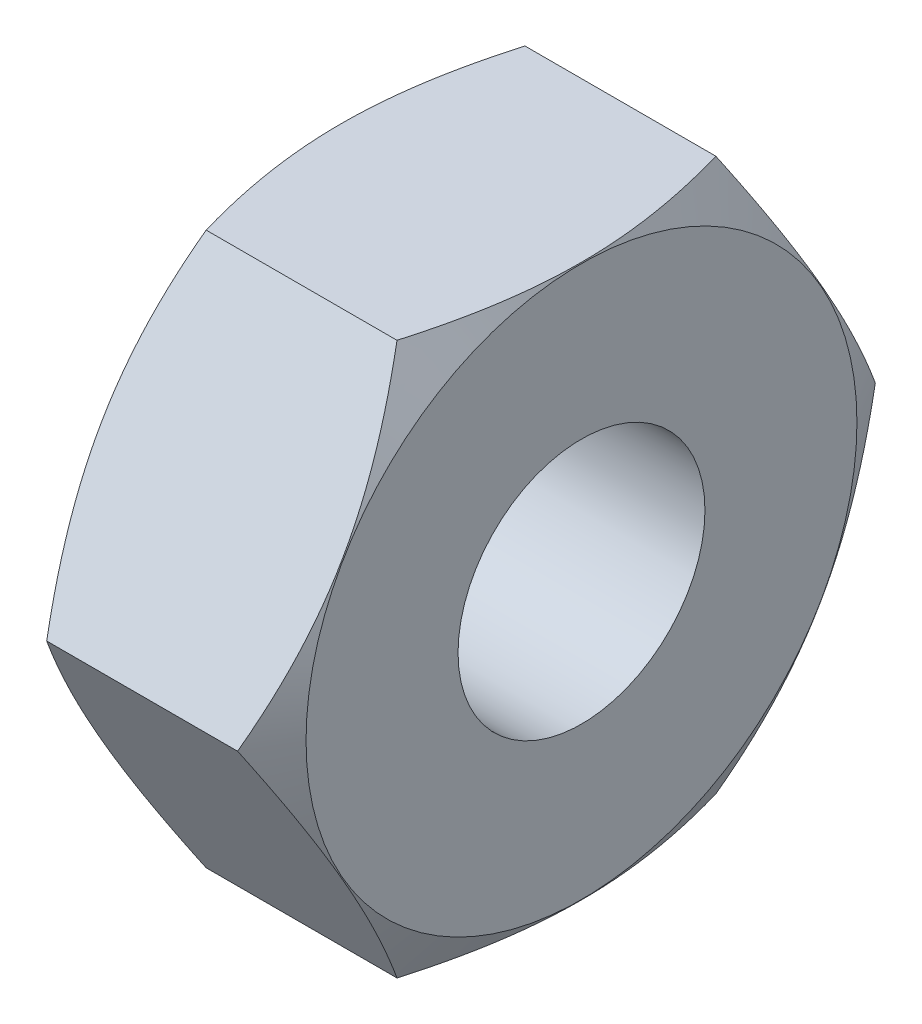
ISO-10303-21;
HEADER;
FILE_DESCRIPTION(('STEP AP214'),'2;1');
FILE_NAME('part.step','',(''),(''),'','','');
FILE_SCHEMA(('AUTOMOTIVE_DESIGN { 1 0 10303 214 1 1 1 1 }'));
ENDSEC;
DATA;
#1=APPLICATION_CONTEXT('core data for automotive mechanical design processes');
#2=APPLICATION_PROTOCOL_DEFINITION('international standard','automotive_design',2000,#1);
#3=PRODUCT_CONTEXT('',#1,'mechanical');
#4=PRODUCT('Part','Part','',(#3));
#5=PRODUCT_RELATED_PRODUCT_CATEGORY('part','',(#4));
#6=PRODUCT_DEFINITION_FORMATION('','',#4);
#7=PRODUCT_DEFINITION_CONTEXT('part definition',#1,'design');
#8=PRODUCT_DEFINITION('design','',#6,#7);
#9=PRODUCT_DEFINITION_SHAPE('','',#8);
#10=(LENGTH_UNIT() NAMED_UNIT(*) SI_UNIT(.MILLI.,.METRE.));
#11=(NAMED_UNIT(*) PLANE_ANGLE_UNIT() SI_UNIT($,.RADIAN.));
#12=(NAMED_UNIT(*) SI_UNIT($,.STERADIAN.) SOLID_ANGLE_UNIT());
#13=UNCERTAINTY_MEASURE_WITH_UNIT(LENGTH_MEASURE(1.E-05),#10,'distance_accuracy_value','');
#14=(GEOMETRIC_REPRESENTATION_CONTEXT(3) GLOBAL_UNCERTAINTY_ASSIGNED_CONTEXT((#13)) GLOBAL_UNIT_ASSIGNED_CONTEXT((#10,
#11,#12)) REPRESENTATION_CONTEXT('',''));
#15=CARTESIAN_POINT('',(0.,0.,0.));
#16=DIRECTION('',(0.,0.,1.));
#17=DIRECTION('',(1.,0.,0.));
#18=AXIS2_PLACEMENT_3D('',#15,#16,#17);
#19=CARTESIAN_POINT('',(2.14892304541081,0.,0.));
#20=DIRECTION('',(-1.,0.,0.));
#21=DIRECTION('',(0.,0.,1.));
#22=AXIS2_PLACEMENT_3D('',#19,#20,#21);
#23=CONICAL_SURFACE('',#22,3.17802018664956,1.04719755114892);
#24=CARTESIAN_POINT('',(2.40000000003932,0.,0.));
#25=DIRECTION('',(-1.,0.,0.));
#26=DIRECTION('',(0.,0.,1.));
#27=AXIS2_PLACEMENT_3D('',#24,#25,#26);
#28=CIRCLE('',#27,2.7431421446712);
#29=CARTESIAN_POINT('',(2.40000000003932,0.,2.7431421446712));
#30=VERTEX_POINT('',#29);
#31=EDGE_CURVE('E142',#30,#30,#28,.F.);
#32=ORIENTED_EDGE('',*,*,#31,.F.);
#33=EDGE_LOOP('',(#32));
#34=FACE_BOUND('',#33,.T.);
#35=CARTESIAN_POINT('',(2.15042052232973,1.45278138934542E-12,-3.17542648054311));
#36=CARTESIAN_POINT('',(2.18652020945351,-0.108296218026511,-3.11290162991242));
#37=CARTESIAN_POINT('',(2.21969549696416,-0.217406043580234,-3.04990704275771));
#38=CARTESIAN_POINT('',(2.27873318069712,-0.437326420572169,-2.92293595390107));
#39=CARTESIAN_POINT('',(2.30458022890113,-0.548140036408943,-2.8589576829678));
#40=CARTESIAN_POINT('',(2.34685631415812,-0.768596354324481,-2.73167716847465));
#41=CARTESIAN_POINT('',(2.36348308627782,-0.878209802028639,-2.66839181493582));
#42=CARTESIAN_POINT('',(2.38698245443939,-1.09812310584404,-2.54142480977955));
#43=CARTESIAN_POINT('',(2.39386475225382,-1.20842216926501,-2.47774361582205));
#44=CARTESIAN_POINT('',(2.39747563485164,-1.4382919216215,-2.34502825242042));
#45=CARTESIAN_POINT('',(2.39331620815094,-1.55787402868246,-2.27598749071847));
#46=CARTESIAN_POINT('',(2.37331145510009,-1.79642268032539,-2.13826136247754));
#47=CARTESIAN_POINT('',(2.35745243373575,-1.91538833883968,-2.06957650750996));
#48=CARTESIAN_POINT('',(2.31491085159293,-2.15482257621697,-1.93133908610689));
#49=CARTESIAN_POINT('',(2.2879704169041,-2.27525560682063,-1.86180704346852));
#50=CARTESIAN_POINT('',(2.22529451656749,-2.51411551057203,-1.72390121373896));
#51=CARTESIAN_POINT('',(2.18957966458872,-2.6325464001957,-1.65552510773434));
#52=CARTESIAN_POINT('',(2.15042052232947,-2.75000000000237,-1.58771324026863));
#53=B_SPLINE_CURVE_WITH_KNOTS('',3,(#35,#36,#37,#38,#39,#40,#41,#42,#43,#44,#45,#46,#47,#48,#49,
#50,#51,#52),.UNSPECIFIED.,.F.,.F.,(4,2,2,2,2,2,2,2,4),(0.,0.390571407838746,0.781954872644651,
1.16458363617538,1.54683117915525,1.96073220717392,2.37511849923312,2.79974871437564,
3.22339073163661),.UNSPECIFIED.);
#54=CARTESIAN_POINT('',(2.1504205223301,-8.74322087722001E-13,-3.17542648054248));
#55=VERTEX_POINT('',#54);
#56=CARTESIAN_POINT('',(2.15042052232986,-2.75000000000118,-1.58771324026932));
#57=VERTEX_POINT('',#56);
#58=EDGE_CURVE('E89',#55,#57,#53,.T.);
#59=ORIENTED_EDGE('',*,*,#58,.F.);
#60=CARTESIAN_POINT('',(2.15042052233038,2.75000000000161,-1.5877132402668));
#61=CARTESIAN_POINT('',(2.19071414778613,2.62915415460132,-1.65748362163914));
#62=CARTESIAN_POINT('',(2.22735909132699,2.5072651695825,-1.72785625995104));
#63=CARTESIAN_POINT('',(2.2913217396723,2.26137677330259,-1.86981999173392));
#64=CARTESIAN_POINT('',(2.31861681938613,2.13737299450275,-1.94141360680458));
#65=CARTESIAN_POINT('',(2.36110357880501,1.89090215357231,-2.08371361316323));
#66=CARTESIAN_POINT('',(2.37657806441176,1.76847300351671,-2.15439811590452));
#67=CARTESIAN_POINT('',(2.39504791617967,1.52303893435101,-2.29609954180572));
#68=CARTESIAN_POINT('',(2.39805858064441,1.40003490671491,-2.36711595027286));
#69=CARTESIAN_POINT('',(2.39177937339437,1.17021507663329,-2.49980249103567));
#70=CARTESIAN_POINT('',(2.38403125518364,1.06336478784995,-2.56149253402775));
#71=CARTESIAN_POINT('',(2.35947923386532,0.850360305060963,-2.68447072950463));
#72=CARTESIAN_POINT('',(2.34266695204388,0.744206847231058,-2.74575845695817));
#73=CARTESIAN_POINT('',(2.30063950150585,0.530763555119573,-2.86898999911552));
#74=CARTESIAN_POINT('',(2.2752462642931,0.423500721339415,-2.93091822507257));
#75=CARTESIAN_POINT('',(2.21761435118308,0.210574416237345,-3.05385128464086));
#76=CARTESIAN_POINT('',(2.18538920779962,0.104908219187618,-3.11485769195179));
#77=CARTESIAN_POINT('',(2.15042052233046,-3.20162906590528E-12,-3.17542648054185));
#78=B_SPLINE_CURVE_WITH_KNOTS('',3,(#60,#61,#62,#63,#64,#65,#66,#67,#68,#69,#70,#71,#72,#73,#74,
#75,#76,#77),.UNSPECIFIED.,.F.,.F.,(4,2,2,2,2,2,2,2,4),(0.,0.435897015898525,0.872841498428282,
1.29897295848179,1.72458122226139,2.09509820114235,2.4659582664875,2.84504223094046,
3.22338221359978),.UNSPECIFIED.);
#79=CARTESIAN_POINT('',(2.15042052233001,2.7500000000008,-1.58771324026945));
#80=VERTEX_POINT('',#79);
#81=EDGE_CURVE('E93',#80,#55,#78,.T.);
#82=ORIENTED_EDGE('',*,*,#81,.F.);
#83=CARTESIAN_POINT('',(2.15042052232947,2.75,1.58771324027273));
#84=CARTESIAN_POINT('',(2.19071414778518,2.75,1.44817247752802));
#85=CARTESIAN_POINT('',(2.22735909132599,2.75,1.30742720090418));
#86=CARTESIAN_POINT('',(2.29132173967118,2.75,1.02349973733834));
#87=CARTESIAN_POINT('',(2.31861681938494,2.75,0.880312507197005));
#88=CARTESIAN_POINT('',(2.36110357880368,2.75,0.595712494479638));
#89=CARTESIAN_POINT('',(2.37657806441035,2.75,0.454343488997021));
#90=CARTESIAN_POINT('',(2.3950479161781,2.75,0.170940637194578));
#91=CARTESIAN_POINT('',(2.39805858064276,2.75,0.0289078202602574));
#92=CARTESIAN_POINT('',(2.39177937339257,2.75,-0.23646526126491));
#93=CARTESIAN_POINT('',(2.38403125518182,2.75,-0.3598453472486));
#94=CARTESIAN_POINT('',(2.35947923386353,2.75,-0.605801738201424));
#95=CARTESIAN_POINT('',(2.34266695204214,2.75,-0.72837719310803));
#96=CARTESIAN_POINT('',(2.30063950150428,2.75,-0.974840277421779));
#97=CARTESIAN_POINT('',(2.27524626429165,2.75,-1.09869672933539));
#98=CARTESIAN_POINT('',(2.21761435118192,2.75,-1.34456284847104));
#99=CARTESIAN_POINT('',(2.18538920779863,2.75,-1.46657566309245));
#100=CARTESIAN_POINT('',(2.15042052232965,2.75,-1.5877132402721));
#101=B_SPLINE_CURVE_WITH_KNOTS('',3,(#83,#84,#85,#86,#87,#88,#89,#90,#91,#92,#93,#94,#95,#96,
#97,#98,#99,#100),.UNSPECIFIED.,.F.,.F.,(4,2,2,2,2,2,2,2,4),(0.,0.435897015898741,
0.872841498428709,1.29897295848245,1.72458122226228,2.09509820114198,2.46595826648586,
2.84504223093748,3.22338221359546),.UNSPECIFIED.);
#102=CARTESIAN_POINT('',(2.15042052232986,2.75000000000118,1.58771324026932));
#103=VERTEX_POINT('',#102);
#104=EDGE_CURVE('E134',#103,#80,#101,.T.);
#105=ORIENTED_EDGE('',*,*,#104,.F.);
#106=CARTESIAN_POINT('',(2.15042052232969,-1.58809752952619E-12,3.17542648054319));
#107=CARTESIAN_POINT('',(2.1865202093893,0.108296217834174,3.11290163002349));
#108=CARTESIAN_POINT('',(2.21969549684621,0.217406043192452,3.04990704298161));
#109=CARTESIAN_POINT('',(2.27873318050031,0.437326419787372,2.92293595435416));
#110=CARTESIAN_POINT('',(2.30458022867931,0.548140035422557,2.85895768353727));
#111=CARTESIAN_POINT('',(2.34685631392451,0.768596352940095,2.73167716927395));
#112=CARTESIAN_POINT('',(2.36348308605626,0.87820980044797,2.6683918158485));
#113=CARTESIAN_POINT('',(2.38698245428116,1.09812310387153,2.54142481091829));
#114=CARTESIAN_POINT('',(2.39386475214679,1.20842216709696,2.47774361707348));
#115=CARTESIAN_POINT('',(2.39747563489613,1.43829191945138,2.34502825367301));
#116=CARTESIAN_POINT('',(2.39331620825858,1.55787402670682,2.27598749185903));
#117=CARTESIAN_POINT('',(2.3733114552912,1.79642267874065,2.13826136339257));
#118=CARTESIAN_POINT('',(2.35745243394708,1.91538833745138,2.06957650831152));
#119=CARTESIAN_POINT('',(2.31491085180498,2.15482257522765,1.93133908667805));
#120=CARTESIAN_POINT('',(2.28797041709526,2.27525560603373,1.86180704392282));
#121=CARTESIAN_POINT('',(2.22529451668474,2.51411551018358,1.72390121396325));
#122=CARTESIAN_POINT('',(2.18957966465306,2.63254640000331,1.65552510784544));
#123=CARTESIAN_POINT('',(2.15042052232947,2.75000000000237,1.58771324026863));
#124=B_SPLINE_CURVE_WITH_KNOTS('',3,(#106,#107,#108,#109,#110,#111,#112,#113,#114,#115,#116,
#117,#118,#119,#120,#121,#122,#123),.UNSPECIFIED.,.F.,.F.,(4,2,2,2,2,2,2,2,4),(0.,
0.390571407144769,0.78195487125283,1.16458363411619,1.54683117643086,1.96073220511382,
2.37511849783946,2.79974871368044,3.22339073163641),.UNSPECIFIED.);
#125=CARTESIAN_POINT('',(2.15042052233048,2.15867719083677E-12,3.17542648054182));
#126=VERTEX_POINT('',#125);
#127=EDGE_CURVE('E85',#126,#103,#124,.T.);
#128=ORIENTED_EDGE('',*,*,#127,.F.);
#129=CARTESIAN_POINT('',(2.15042052233038,-2.75000000000161,1.5877132402668));
#130=CARTESIAN_POINT('',(2.19071414778613,-2.62915415460132,1.65748362163914));
#131=CARTESIAN_POINT('',(2.22735909132699,-2.5072651695825,1.72785625995104));
#132=CARTESIAN_POINT('',(2.2913217396723,-2.26137677330259,1.86981999173393));
#133=CARTESIAN_POINT('',(2.31861681938613,-2.13737299450275,1.94141360680458));
#134=CARTESIAN_POINT('',(2.36110357880501,-1.89090215357231,2.08371361316323));
#135=CARTESIAN_POINT('',(2.37657806441176,-1.76847300351671,2.15439811590453));
#136=CARTESIAN_POINT('',(2.39504791617967,-1.52303893435101,2.29609954180572));
#137=CARTESIAN_POINT('',(2.39805858064441,-1.40003490671491,2.36711595027287));
#138=CARTESIAN_POINT('',(2.39177937339437,-1.17021507663328,2.49980249103568));
#139=CARTESIAN_POINT('',(2.38403125518364,-1.06336478784993,2.56149253402777));
#140=CARTESIAN_POINT('',(2.35947923386531,-0.850360305060917,2.68447072950466));
#141=CARTESIAN_POINT('',(2.34266695204387,-0.744206847231001,2.7457584569582));
#142=CARTESIAN_POINT('',(2.30063950150583,-0.530763555119493,2.86898999911556));
#143=CARTESIAN_POINT('',(2.27524626429307,-0.423500721339323,2.93091822507262));
#144=CARTESIAN_POINT('',(2.21761435118305,-0.21057441623723,3.05385128464093));
#145=CARTESIAN_POINT('',(2.18538920779958,-0.104908219187491,3.11485769195187));
#146=CARTESIAN_POINT('',(2.15042052233041,3.33919464111223E-12,3.17542648054193));
#147=B_SPLINE_CURVE_WITH_KNOTS('',3,(#129,#130,#131,#132,#133,#134,#135,#136,#137,#138,#139,
#140,#141,#142,#143,#144,#145,#146),.UNSPECIFIED.,.F.,.F.,(4,2,2,2,2,2,2,2,4),(0.,
0.435897015898525,0.872841498428282,1.29897295848179,1.72458122226139,2.09509820114239,
2.46595826648758,2.84504223094058,3.22338221359994),.UNSPECIFIED.);
#148=CARTESIAN_POINT('',(2.15042052233001,-2.7500000000008,1.58771324026945));
#149=VERTEX_POINT('',#148);
#150=EDGE_CURVE('E21',#149,#126,#147,.T.);
#151=ORIENTED_EDGE('',*,*,#150,.F.);
#152=CARTESIAN_POINT('',(2.15042052232947,-2.75,-1.58771324027273));
#153=CARTESIAN_POINT('',(2.19071414778518,-2.75,-1.44817247752802));
#154=CARTESIAN_POINT('',(2.22735909132599,-2.75,-1.30742720090418));
#155=CARTESIAN_POINT('',(2.29132173967118,-2.75,-1.02349973733834));
#156=CARTESIAN_POINT('',(2.31861681938494,-2.75,-0.880312507197005));
#157=CARTESIAN_POINT('',(2.36110357880368,-2.75,-0.595712494479638));
#158=CARTESIAN_POINT('',(2.37657806441035,-2.75,-0.454343488997021));
#159=CARTESIAN_POINT('',(2.3950479161781,-2.75,-0.170940637194578));
#160=CARTESIAN_POINT('',(2.39805858064276,-2.75,-0.0289078202602574));
#161=CARTESIAN_POINT('',(2.39177937339257,-2.75,0.23646526126491));
#162=CARTESIAN_POINT('',(2.38403125518182,-2.75,0.3598453472486));
#163=CARTESIAN_POINT('',(2.35947923386353,-2.75,0.605801738201424));
#164=CARTESIAN_POINT('',(2.34266695204214,-2.75,0.72837719310803));
#165=CARTESIAN_POINT('',(2.30063950150428,-2.75,0.974840277421779));
#166=CARTESIAN_POINT('',(2.27524626429165,-2.75,1.09869672933539));
#167=CARTESIAN_POINT('',(2.21761435118192,-2.75,1.34456284847104));
#168=CARTESIAN_POINT('',(2.18538920779863,-2.75,1.46657566309245));
#169=CARTESIAN_POINT('',(2.15042052232965,-2.75,1.5877132402721));
#170=B_SPLINE_CURVE_WITH_KNOTS('',3,(#152,#153,#154,#155,#156,#157,#158,#159,#160,#161,#162,
#163,#164,#165,#166,#167,#168,#169),.UNSPECIFIED.,.F.,.F.,(4,2,2,2,2,2,2,2,4),(0.,
0.435897015898741,0.872841498428709,1.29897295848245,1.72458122226228,2.09509820114198,
2.46595826648586,2.84504223093748,3.22338221359546),.UNSPECIFIED.);
#171=EDGE_CURVE('E71',#57,#149,#170,.T.);
#172=ORIENTED_EDGE('',*,*,#171,.F.);
#173=EDGE_LOOP('',(#59,#82,#105,#128,#151,#172));
#174=FACE_BOUND('',#173,.T.);
#175=ADVANCED_FACE('F17',(#34,#174),#23,.T.);
#176=CARTESIAN_POINT('',(0.,0.,3.17542648054));
#177=DIRECTION('',(0.,-0.50000000000019,0.866025403784329));
#178=DIRECTION('',(0.,-0.866025403784329,-0.50000000000019));
#179=AXIS2_PLACEMENT_3D('',#176,#177,#178);
#180=PLANE('',#179);
#181=ORIENTED_EDGE('',*,*,#150,.T.);
#182=DIRECTION('',(1.,0.,0.));
#183=VECTOR('',#182,1.);
#184=CARTESIAN_POINT('',(0.,9.78384040450919E-13,3.17542648054171));
#185=LINE('',#184,#183);
#186=CARTESIAN_POINT('',(0.249579465219581,-3.75031432139668E-08,3.17542645888812));
#187=VERTEX_POINT('',#186);
#188=EDGE_CURVE('E147',#187,#126,#185,.T.);
#189=ORIENTED_EDGE('',*,*,#188,.F.);
#190=CARTESIAN_POINT('',(0.249579452715485,-2.74999992498764,1.58771328357798));
#191=CARTESIAN_POINT('',(0.209285829319943,-2.62915408085408,1.65748366421779));
#192=CARTESIAN_POINT('',(0.172640887966145,-2.50726509711079,1.72785630179278));
#193=CARTESIAN_POINT('',(0.10867824415789,-2.26137670350815,1.86982003202958));
#194=CARTESIAN_POINT('',(0.0813831667911862,-2.13737292611086,1.9414136462906));
#195=CARTESIAN_POINT('',(0.0388964120103443,-1.89090208792963,2.0837136510621));
#196=CARTESIAN_POINT('',(0.0234219287087635,-1.76847293921509,2.15439815302909));
#197=CARTESIAN_POINT('',(0.00495208139427285,-1.52303887288675,2.29609957729211));
#198=CARTESIAN_POINT('',(0.00194141907967536,-1.40003484674664,2.36711598489556));
#199=CARTESIAN_POINT('',(0.00822062972550785,-1.17021502934359,2.4998025183384));
#200=CARTESIAN_POINT('',(0.0159687483505298,-1.06336475170375,2.56149255489678));
#201=CARTESIAN_POINT('',(0.040520768537515,-0.850360291112134,2.68447073755799));
#202=CARTESIAN_POINT('',(0.0573330488088625,-0.744206844335755,2.74575845862977));
#203=CARTESIAN_POINT('',(0.0993604945101079,-0.530763574647563,2.86898998784103));
#204=CARTESIAN_POINT('',(0.124753728373979,-0.423500752227346,2.93091820723941));
#205=CARTESIAN_POINT('',(0.182385633514425,-0.210574469459351,3.05385125391312));
#206=CARTESIAN_POINT('',(0.214610772283519,-0.104908283385116,3.11485765488735));
#207=CARTESIAN_POINT('',(0.249579452717868,-7.5007292096348E-08,3.17542643723452));
#208=B_SPLINE_CURVE_WITH_KNOTS('',3,(#190,#191,#192,#193,#194,#195,#196,#197,#198,#199,#200,
#201,#202,#203,#204,#205,#206,#207),.UNSPECIFIED.,.F.,.F.,(4,2,2,2,2,2,2,2,4),(0.,
0.435897009958034,0.872841486384562,1.29897294106713,1.72458119954067,2.09509814009642,
2.46595816697182,2.84504209091765,3.22338203335723),.UNSPECIFIED.);
#209=CARTESIAN_POINT('',(0.249579482525675,-2.75,1.58771325691191));
#210=VERTEX_POINT('',#209);
#211=EDGE_CURVE('E92',#210,#187,#208,.T.);
#212=ORIENTED_EDGE('',*,*,#211,.F.);
#213=DIRECTION('',(1.,0.,0.));
#214=VECTOR('',#213,1.);
#215=CARTESIAN_POINT('',(0.,-2.75,1.58771324027));
#216=LINE('',#215,#214);
#217=EDGE_CURVE('E76',#149,#210,#216,.F.);
#218=ORIENTED_EDGE('',*,*,#217,.F.);
#219=EDGE_LOOP('',(#181,#189,#212,#218));
#220=FACE_BOUND('',#219,.T.);
#221=ADVANCED_FACE('F91',(#220),#180,.T.);
#222=CARTESIAN_POINT('',(0.,-2.75,-1.58771324027));
#223=DIRECTION('',(0.,-0.50000000000019,-0.866025403784329));
#224=DIRECTION('',(0.,0.866025403784329,-0.50000000000019));
#225=AXIS2_PLACEMENT_3D('',#222,#223,#224);
#226=PLANE('',#225);
#227=ORIENTED_EDGE('',*,*,#58,.T.);
#228=DIRECTION('',(1.,0.,0.));
#229=VECTOR('',#228,1.);
#230=CARTESIAN_POINT('',(0.,-2.75,-1.58771324027));
#231=LINE('',#230,#229);
#232=CARTESIAN_POINT('',(0.249579465214229,-2.74999996247797,-1.58771326193335));
#233=VERTEX_POINT('',#232);
#234=EDGE_CURVE('E79',#233,#57,#231,.T.);
#235=ORIENTED_EDGE('',*,*,#234,.F.);
#236=CARTESIAN_POINT('',(0.249579469146743,-2.57633114360482E-08,-3.17542646566782));
#237=CARTESIAN_POINT('',(0.213479783285923,-0.108296241505791,-3.11290161635665));
#238=CARTESIAN_POINT('',(0.180304496973031,-0.21740606474081,-3.04990703054065));
#239=CARTESIAN_POINT('',(0.121266815404508,-0.43732643700247,-2.92293594441503));
#240=CARTESIAN_POINT('',(0.0954197681654341,-0.54814005042728,-2.85895767487431));
#241=CARTESIAN_POINT('',(0.053143684447287,-0.768596363616322,-2.73167716311));
#242=CARTESIAN_POINT('',(0.0365169129183502,-0.878209809008909,-2.66839181090575));
#243=CARTESIAN_POINT('',(0.0130175455323755,-1.09812310817093,-2.54142480843612));
#244=CARTESIAN_POINT('',(0.00613524790405531,-1.2084221692502,-2.47774361583061));
#245=CARTESIAN_POINT('',(0.00252436528590002,-1.43829191314872,-2.34502825731218));
#246=CARTESIAN_POINT('',(0.00668379138035932,-1.55787401408844,-2.27598749914434));
#247=CARTESIAN_POINT('',(0.0266885420653745,-1.796422653587,-2.13826137791495));
#248=CARTESIAN_POINT('',(0.0425475616665185,-1.91538830607846,-2.06957652642465));
#249=CARTESIAN_POINT('',(0.0850891393136101,-2.15482253123364,-1.93133911207803));
#250=CARTESIAN_POINT('',(0.112029571227413,-2.2752555556459,-1.86180707301425));
#251=CARTESIAN_POINT('',(0.174705465397075,-2.51411544728145,-1.7239012502798));
#252=CARTESIAN_POINT('',(0.210420313988937,-2.63254633097949,-1.65552514769633));
#253=CARTESIAN_POINT('',(0.249579452706888,-2.74999992495595,-1.5877132835967));
#254=B_SPLINE_CURVE_WITH_KNOTS('',3,(#236,#237,#238,#239,#240,#241,#242,#243,#244,#245,#246,
#247,#248,#249,#250,#251,#252,#253),.UNSPECIFIED.,.F.,.F.,(4,2,2,2,2,2,2,2,4),(0.,
0.390571399170898,0.781954855225056,1.16458361060652,1.54683114547958,1.96073215233239,
2.37511842312099,2.79974861565666,3.22339061053235),.UNSPECIFIED.);
#255=CARTESIAN_POINT('',(0.249579473887582,-1.15388170003086E-08,-3.1754264738792));
#256=VERTEX_POINT('',#255);
#257=EDGE_CURVE('E173',#256,#233,#254,.T.);
#258=ORIENTED_EDGE('',*,*,#257,.F.);
#259=DIRECTION('',(1.,0.,0.));
#260=VECTOR('',#259,1.);
#261=CARTESIAN_POINT('',(0.,0.,-3.17542648054));
#262=LINE('',#261,#260);
#263=EDGE_CURVE('E96',#55,#256,#262,.F.);
#264=ORIENTED_EDGE('',*,*,#263,.F.);
#265=EDGE_LOOP('',(#227,#235,#258,#264));
#266=FACE_BOUND('',#265,.T.);
#267=ADVANCED_FACE('F185',(#266),#226,.T.);
#268=CARTESIAN_POINT('',(0.,-2.75,1.58771324027));
#269=DIRECTION('',(0.,-1.,0.));
#270=DIRECTION('',(0.,0.,-1.));
#271=AXIS2_PLACEMENT_3D('',#268,#269,#270);
#272=PLANE('',#271);
#273=ORIENTED_EDGE('',*,*,#171,.T.);
#274=ORIENTED_EDGE('',*,*,#217,.T.);
#275=CARTESIAN_POINT('',(0.249579510007485,-2.74999996249266,-1.58771326704695));
#276=CARTESIAN_POINT('',(0.209285868525809,-2.74999998652904,-1.44817250542135));
#277=CARTESIAN_POINT('',(0.172640917659986,-2.74999999638956,-1.30742722764345));
#278=CARTESIAN_POINT('',(0.10867826258306,-2.75000000361912,-1.02349975992967));
#279=CARTESIAN_POINT('',(0.0813831834665894,-2.75000000095809,-0.880312526792823));
#280=CARTESIAN_POINT('',(0.0388964235929998,-2.74999999906562,-0.595712509030681));
#281=CARTESIAN_POINT('',(0.0234219369420831,-2.74999999975092,-0.454343501493294));
#282=CARTESIAN_POINT('',(0.00495208397868696,-2.75000000024877,-0.170940645298962));
#283=CARTESIAN_POINT('',(0.00194141936988052,-2.75000000006238,-0.0289078260271915));
#284=CARTESIAN_POINT('',(0.00822062661183507,-2.74999999994569,0.236465260311874));
#285=CARTESIAN_POINT('',(0.0159687449635967,-2.74999999998536,0.359845348775928));
#286=CARTESIAN_POINT('',(0.0405207669445703,-2.75000000001465,0.605801744603954));
#287=CARTESIAN_POINT('',(0.0573330492842055,-2.75000000000422,0.728377201905747));
#288=CARTESIAN_POINT('',(0.0993605011940847,-2.74999999999568,0.97484029131935));
#289=CARTESIAN_POINT('',(0.124753739288066,-2.74999999999784,1.09869674593234));
#290=CARTESIAN_POINT('',(0.182385654409994,-2.75000000000215,1.34456287045413));
#291=CARTESIAN_POINT('',(0.214610798927481,-2.7500000000043,1.46657568776157));
#292=CARTESIAN_POINT('',(0.249579485608193,-2.75,1.58771326759006));
#293=B_SPLINE_CURVE_WITH_KNOTS('',3,(#275,#276,#277,#278,#279,#280,#281,#282,#283,#284,#285,
#286,#287,#288,#289,#290,#291,#292),.UNSPECIFIED.,.F.,.F.,(4,2,2,2,2,2,2,2,4),(0.,
0.435897024725808,0.872841515413833,1.29897298210101,1.72458125279201,2.09509823912618,
2.46595831177614,2.84504228468297,3.22338227598873),.UNSPECIFIED.);
#294=EDGE_CURVE('E168',#233,#210,#293,.T.);
#295=ORIENTED_EDGE('',*,*,#294,.F.);
#296=ORIENTED_EDGE('',*,*,#234,.T.);
#297=EDGE_LOOP('',(#273,#274,#295,#296));
#298=FACE_BOUND('',#297,.T.);
#299=ADVANCED_FACE('F73',(#298),#272,.T.);
#300=CARTESIAN_POINT('',(0.,0.,-3.17542648054));
#301=DIRECTION('',(0.,0.50000000000019,-0.866025403784329));
#302=DIRECTION('',(0.,0.866025403784329,0.50000000000019));
#303=AXIS2_PLACEMENT_3D('',#300,#301,#302);
#304=PLANE('',#303);
#305=ORIENTED_EDGE('',*,*,#81,.T.);
#306=ORIENTED_EDGE('',*,*,#263,.T.);
#307=CARTESIAN_POINT('',(0.249579452721002,2.74999992497935,-1.58771328358926));
#308=CARTESIAN_POINT('',(0.209285829321948,2.62915408082773,-1.65748366423534));
#309=CARTESIAN_POINT('',(0.172640887964302,2.50726509706749,-1.7278563018184));
#310=CARTESIAN_POINT('',(0.108678244149612,2.26137670342951,-1.86982003207436));
#311=CARTESIAN_POINT('',(0.0813831667804853,2.13737292601381,-1.94141364634647));
#312=CARTESIAN_POINT('',(0.038896412005568,1.89090208783021,-2.08371365111966));
#313=CARTESIAN_POINT('',(0.0234219287090597,1.76847293913216,-2.15439815307702));
#314=CARTESIAN_POINT('',(0.0049520814009161,1.52303887283989,-2.29609957731912));
#315=CARTESIAN_POINT('',(0.00194141908743711,1.40003484671936,-2.3671159849113));
#316=CARTESIAN_POINT('',(0.0082206298488324,1.17021502516671,-2.49980252074993));
#317=CARTESIAN_POINT('',(0.0159687489658049,1.06336474336663,-2.56149255971021));
#318=CARTESIAN_POINT('',(0.0405207708130282,0.850360274523724,-2.68447074713531));
#319=CARTESIAN_POINT('',(0.0573330522542671,0.744206823656442,-2.74575847056898));
#320=CARTESIAN_POINT('',(0.0993605008724064,0.530763545691749,-2.86899000455868));
#321=CARTESIAN_POINT('',(0.124753736504405,0.423500719089996,-2.93091822637127));
#322=CARTESIAN_POINT('',(0.182385645565559,0.210574428111149,-3.05385127778552));
#323=CARTESIAN_POINT('',(0.214610786484892,0.104908238007048,-3.11485768108639));
#324=CARTESIAN_POINT('',(0.249579469181236,2.56558916883779E-08,-3.17542646572757));
#325=B_SPLINE_CURVE_WITH_KNOTS('',3,(#307,#308,#309,#310,#311,#312,#313,#314,#315,#316,#317,
#318,#319,#320,#321,#322,#323,#324),.UNSPECIFIED.,.F.,.F.,(4,2,2,2,2,2,2,2,4),(0.,
0.435897010015175,0.872841486506387,1.29897294112973,1.72458119953862,2.09509815452634,
2.46595819588714,2.84504213507079,3.2233820926321),.UNSPECIFIED.);
#326=CARTESIAN_POINT('',(0.249579482539578,2.75,-1.58771325691537));
#327=VERTEX_POINT('',#326);
#328=EDGE_CURVE('E162',#327,#256,#325,.T.);
#329=ORIENTED_EDGE('',*,*,#328,.F.);
#330=DIRECTION('',(1.,0.,0.));
#331=VECTOR('',#330,1.);
#332=CARTESIAN_POINT('',(0.,2.75,-1.58771324027));
#333=LINE('',#332,#331);
#334=EDGE_CURVE('E140',#80,#327,#333,.F.);
#335=ORIENTED_EDGE('',*,*,#334,.F.);
#336=EDGE_LOOP('',(#305,#306,#329,#335));
#337=FACE_BOUND('',#336,.T.);
#338=ADVANCED_FACE('F155',(#337),#304,.T.);
#339=CARTESIAN_POINT('',(0.,2.75,1.58771324027));
#340=DIRECTION('',(0.,0.50000000000019,0.866025403784329));
#341=DIRECTION('',(0.,-0.866025403784329,0.50000000000019));
#342=AXIS2_PLACEMENT_3D('',#339,#340,#341);
#343=PLANE('',#342);
#344=ORIENTED_EDGE('',*,*,#127,.T.);
#345=DIRECTION('',(1.,0.,0.));
#346=VECTOR('',#345,1.);
#347=CARTESIAN_POINT('',(0.,2.75,1.58771324027));
#348=LINE('',#347,#346);
#349=CARTESIAN_POINT('',(0.249579465221948,2.74999996246242,1.58771326194233));
#350=VERTEX_POINT('',#349);
#351=EDGE_CURVE('E141',#350,#103,#348,.T.);
#352=ORIENTED_EDGE('',*,*,#351,.F.);
#353=CARTESIAN_POINT('',(0.249579509987926,-4.19026751208586E-08,3.17542646143947));
#354=CARTESIAN_POINT('',(0.213479806924472,0.108296187136077,3.11290163219745));
#355=CARTESIAN_POINT('',(0.180304512162056,0.217406018600725,3.04990705301222));
#356=CARTESIAN_POINT('',(0.121266821803292,0.43732640278948,2.92293596834399));
#357=CARTESIAN_POINT('',(0.0954197742296695,0.548140019900502,2.85895769360635));
#358=CARTESIAN_POINT('',(0.0531436885312966,0.768596341352279,2.73167717488152));
#359=CARTESIAN_POINT('',(0.0365169153575573,0.878209791286512,2.66839182084705));
#360=CARTESIAN_POINT('',(0.0130175459451585,1.09812309937195,2.54142481380665));
#361=CARTESIAN_POINT('',(0.0061352479400783,1.20842216483373,2.47774361846118));
#362=CARTESIAN_POINT('',(0.00252436534142114,1.4382919129963,2.34502825731277));
#363=CARTESIAN_POINT('',(0.00668379139164812,1.55787401381872,2.27598749927649));
#364=CARTESIAN_POINT('',(0.0266885419985653,1.79642265299481,2.13826137828044));
#365=CARTESIAN_POINT('',(0.0425475615593725,1.9153883052815,2.06957652689159));
#366=CARTESIAN_POINT('',(0.0850891391401079,2.15482253035005,1.9313391125812));
#367=CARTESIAN_POINT('',(0.112029571055062,2.27525555487687,1.86180707345477));
#368=CARTESIAN_POINT('',(0.174705465273032,2.5141154468382,1.72390125053919));
#369=CARTESIAN_POINT('',(0.210420313919388,2.63254633074602,1.65552514783807));
#370=CARTESIAN_POINT('',(0.24957945270953,2.74999992492517,1.58771328361447));
#371=B_SPLINE_CURVE_WITH_KNOTS('',3,(#353,#354,#355,#356,#357,#358,#359,#360,#361,#362,#363,
#364,#365,#366,#367,#368,#369,#370),.UNSPECIFIED.,.F.,.F.,(4,2,2,2,2,2,2,2,4),(0.,
0.390571416620827,0.781954889598732,1.1645836601695,1.54683121045756,1.96073221683872,
2.3751184869253,2.79974867984744,3.223390675463),.UNSPECIFIED.);
#372=EDGE_CURVE('E39',#187,#350,#371,.T.);
#373=ORIENTED_EDGE('',*,*,#372,.F.);
#374=ORIENTED_EDGE('',*,*,#188,.T.);
#375=EDGE_LOOP('',(#344,#352,#373,#374));
#376=FACE_BOUND('',#375,.T.);
#377=ADVANCED_FACE('F128',(#376),#343,.T.);
#378=CARTESIAN_POINT('',(0.,2.75,-1.58771324027));
#379=DIRECTION('',(0.,1.,0.));
#380=DIRECTION('',(0.,0.,1.));
#381=AXIS2_PLACEMENT_3D('',#378,#379,#380);
#382=PLANE('',#381);
#383=ORIENTED_EDGE('',*,*,#104,.T.);
#384=ORIENTED_EDGE('',*,*,#334,.T.);
#385=CARTESIAN_POINT('',(0.24957951002583,2.74999996247614,1.58771326702833));
#386=CARTESIAN_POINT('',(0.209285868536963,2.74999998652311,1.44817250540349));
#387=CARTESIAN_POINT('',(0.172640917667897,2.74999999638797,1.3074272276253));
#388=CARTESIAN_POINT('',(0.108678262588241,2.75000000362071,1.02349975991008));
#389=CARTESIAN_POINT('',(0.0813831834722856,2.75000000095852,0.880312526772082));
#390=CARTESIAN_POINT('',(0.0388964235993058,2.7499999990652,0.595712509008121));
#391=CARTESIAN_POINT('',(0.0234219369484735,2.74999999975081,0.454343501470068));
#392=CARTESIAN_POINT('',(0.00495208398588861,2.75000000024888,0.170940645274322));
#393=CARTESIAN_POINT('',(0.00194141937781184,2.75000000006241,0.028907826001804));
#394=CARTESIAN_POINT('',(0.0082206266213461,2.74999999994567,-0.236465260336381));
#395=CARTESIAN_POINT('',(0.0159687449737529,2.74999999998536,-0.359845348798824));
#396=CARTESIAN_POINT('',(0.0405207669559141,2.75000000001466,-0.605801744623559));
#397=CARTESIAN_POINT('',(0.0573330492960898,2.75000000000423,-0.728377201923673));
#398=CARTESIAN_POINT('',(0.0993605012069595,2.74999999999568,-0.974840291334019));
#399=CARTESIAN_POINT('',(0.124753739301399,2.74999999999784,-1.09869674594543));
#400=CARTESIAN_POINT('',(0.182385654424154,2.75000000000215,-1.34456287046407));
#401=CARTESIAN_POINT('',(0.214610798942011,2.7500000000043,-1.46657568776994));
#402=CARTESIAN_POINT('',(0.249579485623056,2.75,-1.58771326759685));
#403=B_SPLINE_CURVE_WITH_KNOTS('',3,(#385,#386,#387,#388,#389,#390,#391,#392,#393,#394,#395,
#396,#397,#398,#399,#400,#401,#402),.UNSPECIFIED.,.F.,.F.,(4,2,2,2,2,2,2,2,4),(0.,
0.435897024729043,0.872841515420008,1.2989729821092,1.72458125280232,2.0950982391318,
2.46595831177699,2.84504228467946,3.22338227598094),.UNSPECIFIED.);
#404=EDGE_CURVE('E107',#350,#327,#403,.T.);
#405=ORIENTED_EDGE('',*,*,#404,.F.);
#406=ORIENTED_EDGE('',*,*,#351,.T.);
#407=EDGE_LOOP('',(#383,#384,#405,#406));
#408=FACE_BOUND('',#407,.T.);
#409=ADVANCED_FACE('F123',(#408),#382,.T.);
#410=CARTESIAN_POINT('',(2.4,0.,0.));
#411=DIRECTION('',(1.,0.,0.));
#412=DIRECTION('',(0.,0.,-1.));
#413=AXIS2_PLACEMENT_3D('',#410,#411,#412);
#414=PLANE('',#413);
#415=CARTESIAN_POINT('',(2.4,0.,0.));
#416=DIRECTION('',(1.,0.,0.));
#417=DIRECTION('',(0.,0.,-1.));
#418=AXIS2_PLACEMENT_3D('',#415,#416,#417);
#419=CIRCLE('',#418,1.2295);
#420=CARTESIAN_POINT('',(2.4,0.,-1.2295));
#421=VERTEX_POINT('',#420);
#422=EDGE_CURVE('E104',#421,#421,#419,.F.);
#423=ORIENTED_EDGE('',*,*,#422,.T.);
#424=EDGE_LOOP('',(#423));
#425=FACE_BOUND('',#424,.T.);
#426=ORIENTED_EDGE('',*,*,#31,.T.);
#427=EDGE_LOOP('',(#426));
#428=FACE_BOUND('',#427,.T.);
#429=ADVANCED_FACE('F127',(#425,#428),#414,.T.);
#430=CARTESIAN_POINT('',(0.251082103147837,0.,0.));
#431=DIRECTION('',(1.,0.,0.));
#432=DIRECTION('',(0.,0.,-1.));
#433=AXIS2_PLACEMENT_3D('',#430,#431,#432);
#434=CONICAL_SURFACE('',#433,3.1780291041029,1.04719755119745);
#435=CARTESIAN_POINT('',(1.64925581871977E-11,0.,0.));
#436=DIRECTION('',(1.,0.,0.));
#437=DIRECTION('',(0.,0.,-1.));
#438=AXIS2_PLACEMENT_3D('',#435,#436,#437);
#439=CIRCLE('',#438,2.74314214462131);
#440=CARTESIAN_POINT('',(1.64925581871977E-11,0.,-2.74314214462131));
#441=VERTEX_POINT('',#440);
#442=EDGE_CURVE('E30',#441,#441,#439,.T.);
#443=ORIENTED_EDGE('',*,*,#442,.T.);
#444=EDGE_LOOP('',(#443));
#445=FACE_BOUND('',#444,.T.);
#446=ORIENTED_EDGE('',*,*,#372,.T.);
#447=ORIENTED_EDGE('',*,*,#404,.T.);
#448=ORIENTED_EDGE('',*,*,#328,.T.);
#449=ORIENTED_EDGE('',*,*,#257,.T.);
#450=ORIENTED_EDGE('',*,*,#294,.T.);
#451=ORIENTED_EDGE('',*,*,#211,.T.);
#452=EDGE_LOOP('',(#446,#447,#448,#449,#450,#451));
#453=FACE_BOUND('',#452,.T.);
#454=ADVANCED_FACE('F119',(#445,#453),#434,.T.);
#455=CARTESIAN_POINT('',(1.2,0.,0.));
#456=DIRECTION('',(1.,0.,0.));
#457=DIRECTION('',(0.,0.,-1.));
#458=AXIS2_PLACEMENT_3D('',#455,#456,#457);
#459=CYLINDRICAL_SURFACE('',#458,1.2295);
#460=ORIENTED_EDGE('',*,*,#422,.F.);
#461=EDGE_LOOP('',(#460));
#462=FACE_BOUND('',#461,.T.);
#463=CARTESIAN_POINT('',(0.,0.,0.));
#464=DIRECTION('',(1.,0.,0.));
#465=DIRECTION('',(0.,0.,-1.));
#466=AXIS2_PLACEMENT_3D('',#463,#464,#465);
#467=CIRCLE('',#466,1.2295);
#468=CARTESIAN_POINT('',(0.,0.,-1.2295));
#469=VERTEX_POINT('',#468);
#470=EDGE_CURVE('E11',#469,#469,#467,.F.);
#471=ORIENTED_EDGE('',*,*,#470,.T.);
#472=EDGE_LOOP('',(#471));
#473=FACE_BOUND('',#472,.T.);
#474=ADVANCED_FACE('F206',(#462,#473),#459,.F.);
#475=CARTESIAN_POINT('',(0.,0.,0.));
#476=DIRECTION('',(1.,0.,0.));
#477=DIRECTION('',(0.,0.,-1.));
#478=AXIS2_PLACEMENT_3D('',#475,#476,#477);
#479=PLANE('',#478);
#480=ORIENTED_EDGE('',*,*,#470,.F.);
#481=EDGE_LOOP('',(#480));
#482=FACE_BOUND('',#481,.T.);
#483=ORIENTED_EDGE('',*,*,#442,.F.);
#484=EDGE_LOOP('',(#483));
#485=FACE_BOUND('',#484,.T.);
#486=ADVANCED_FACE('F213',(#482,#485),#479,.F.);
#487=CLOSED_SHELL('',(#175,#221,#267,#299,#338,#377,#409,#429,#454,#474,#486));
#488=MANIFOLD_SOLID_BREP('B1',#487);
#489=ADVANCED_BREP_SHAPE_REPRESENTATION('',(#18,#488),#14);
#490=SHAPE_DEFINITION_REPRESENTATION(#9,#489);
ENDSEC;
END-ISO-10303-21;
